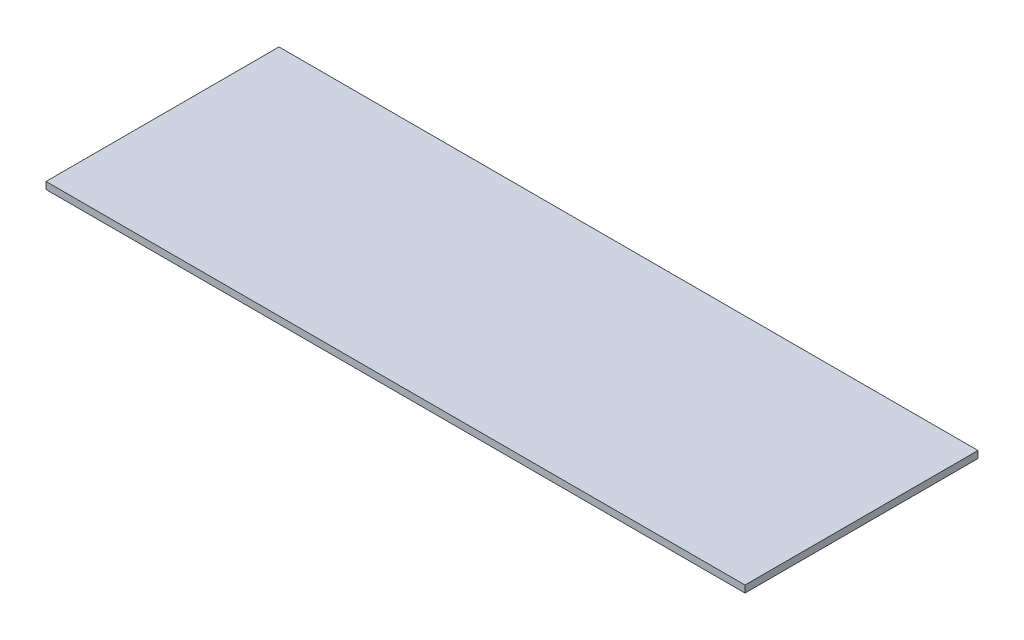
ISO-10303-21;
HEADER;
FILE_DESCRIPTION(('STEP AP214'),'2;1');
FILE_NAME('part.step','',(''),(''),'','','');
FILE_SCHEMA(('AUTOMOTIVE_DESIGN { 1 0 10303 214 1 1 1 1 }'));
ENDSEC;
DATA;
#1=APPLICATION_CONTEXT('core data for automotive mechanical design processes');
#2=APPLICATION_PROTOCOL_DEFINITION('international standard','automotive_design',2000,#1);
#3=PRODUCT_CONTEXT('',#1,'mechanical');
#4=PRODUCT('Part','Part','',(#3));
#5=PRODUCT_RELATED_PRODUCT_CATEGORY('part','',(#4));
#6=PRODUCT_DEFINITION_FORMATION('','',#4);
#7=PRODUCT_DEFINITION_CONTEXT('part definition',#1,'design');
#8=PRODUCT_DEFINITION('design','',#6,#7);
#9=PRODUCT_DEFINITION_SHAPE('','',#8);
#10=(LENGTH_UNIT() NAMED_UNIT(*) SI_UNIT(.MILLI.,.METRE.));
#11=(NAMED_UNIT(*) PLANE_ANGLE_UNIT() SI_UNIT($,.RADIAN.));
#12=(NAMED_UNIT(*) SI_UNIT($,.STERADIAN.) SOLID_ANGLE_UNIT());
#13=UNCERTAINTY_MEASURE_WITH_UNIT(LENGTH_MEASURE(1.E-05),#10,'distance_accuracy_value','');
#14=(GEOMETRIC_REPRESENTATION_CONTEXT(3) GLOBAL_UNCERTAINTY_ASSIGNED_CONTEXT((#13)) GLOBAL_UNIT_ASSIGNED_CONTEXT((#10,
#11,#12)) REPRESENTATION_CONTEXT('',''));
#15=CARTESIAN_POINT('',(0.,0.,0.));
#16=DIRECTION('',(0.,0.,1.));
#17=DIRECTION('',(1.,0.,0.));
#18=AXIS2_PLACEMENT_3D('',#15,#16,#17);
#19=CARTESIAN_POINT('',(-9.94318181818181,3.,81.5056818181818));
#20=DIRECTION('',(1.,0.,0.));
#21=DIRECTION('',(0.,0.,-1.));
#22=AXIS2_PLACEMENT_3D('',#19,#20,#21);
#23=PLANE('',#22);
#24=DIRECTION('',(0.,0.,1.));
#25=VECTOR('',#24,1.);
#26=CARTESIAN_POINT('',(-9.94318181818181,0.,81.5056818181818));
#27=LINE('',#26,#25);
#28=CARTESIAN_POINT('',(-9.94318181818181,0.,-18.4943181818182));
#29=VERTEX_POINT('',#28);
#30=CARTESIAN_POINT('',(-9.94318181818181,0.,81.5056818181818));
#31=VERTEX_POINT('',#30);
#32=EDGE_CURVE('E111',#29,#31,#27,.T.);
#33=ORIENTED_EDGE('',*,*,#32,.T.);
#34=DIRECTION('',(0.,-1.,0.));
#35=VECTOR('',#34,1.);
#36=CARTESIAN_POINT('',(-9.94318181818181,3.,81.5056818181818));
#37=LINE('',#36,#35);
#38=CARTESIAN_POINT('',(-9.94318181818181,3.,81.5056818181818));
#39=VERTEX_POINT('',#38);
#40=EDGE_CURVE('E11',#39,#31,#37,.T.);
#41=ORIENTED_EDGE('',*,*,#40,.F.);
#42=DIRECTION('',(0.,0.,1.));
#43=VECTOR('',#42,1.);
#44=CARTESIAN_POINT('',(-9.94318181818181,3.,81.5056818181818));
#45=LINE('',#44,#43);
#46=CARTESIAN_POINT('',(-9.94318181818181,3.,-18.4943181818182));
#47=VERTEX_POINT('',#46);
#48=EDGE_CURVE('E95',#47,#39,#45,.T.);
#49=ORIENTED_EDGE('',*,*,#48,.F.);
#50=DIRECTION('',(0.,-1.,0.));
#51=VECTOR('',#50,1.);
#52=CARTESIAN_POINT('',(-9.94318181818181,3.,-18.4943181818182));
#53=LINE('',#52,#51);
#54=EDGE_CURVE('E107',#47,#29,#53,.T.);
#55=ORIENTED_EDGE('',*,*,#54,.T.);
#56=EDGE_LOOP('',(#33,#41,#49,#55));
#57=FACE_BOUND('',#56,.T.);
#58=ADVANCED_FACE('F43',(#57),#23,.F.);
#59=CARTESIAN_POINT('',(-9.94318181818181,3.,81.5056818181818));
#60=DIRECTION('',(0.,0.,-1.));
#61=DIRECTION('',(-1.,0.,0.));
#62=AXIS2_PLACEMENT_3D('',#59,#60,#61);
#63=PLANE('',#62);
#64=DIRECTION('',(1.,0.,0.));
#65=VECTOR('',#64,1.);
#66=CARTESIAN_POINT('',(-9.94318181818181,0.,81.5056818181818));
#67=LINE('',#66,#65);
#68=CARTESIAN_POINT('',(290.056818181818,0.,81.5056818181818));
#69=VERTEX_POINT('',#68);
#70=EDGE_CURVE('E100',#31,#69,#67,.T.);
#71=ORIENTED_EDGE('',*,*,#70,.T.);
#72=DIRECTION('',(0.,-1.,0.));
#73=VECTOR('',#72,1.);
#74=CARTESIAN_POINT('',(290.056818181818,3.,81.5056818181818));
#75=LINE('',#74,#73);
#76=CARTESIAN_POINT('',(290.056818181818,3.,81.5056818181818));
#77=VERTEX_POINT('',#76);
#78=EDGE_CURVE('E52',#77,#69,#75,.T.);
#79=ORIENTED_EDGE('',*,*,#78,.F.);
#80=DIRECTION('',(1.,0.,0.));
#81=VECTOR('',#80,1.);
#82=CARTESIAN_POINT('',(-9.94318181818181,3.,81.5056818181818));
#83=LINE('',#82,#81);
#84=EDGE_CURVE('E90',#39,#77,#83,.T.);
#85=ORIENTED_EDGE('',*,*,#84,.F.);
#86=ORIENTED_EDGE('',*,*,#40,.T.);
#87=EDGE_LOOP('',(#71,#79,#85,#86));
#88=FACE_BOUND('',#87,.T.);
#89=ADVANCED_FACE('F99',(#88),#63,.F.);
#90=CARTESIAN_POINT('',(290.056818181818,3.,81.5056818181818));
#91=DIRECTION('',(-1.,0.,0.));
#92=DIRECTION('',(0.,0.,1.));
#93=AXIS2_PLACEMENT_3D('',#90,#91,#92);
#94=PLANE('',#93);
#95=DIRECTION('',(0.,0.,-1.));
#96=VECTOR('',#95,1.);
#97=CARTESIAN_POINT('',(290.056818181818,0.,81.5056818181818));
#98=LINE('',#97,#96);
#99=CARTESIAN_POINT('',(290.056818181818,0.,-18.4943181818182));
#100=VERTEX_POINT('',#99);
#101=EDGE_CURVE('E77',#69,#100,#98,.T.);
#102=ORIENTED_EDGE('',*,*,#101,.T.);
#103=DIRECTION('',(0.,-1.,0.));
#104=VECTOR('',#103,1.);
#105=CARTESIAN_POINT('',(290.056818181818,3.,-18.4943181818182));
#106=LINE('',#105,#104);
#107=CARTESIAN_POINT('',(290.056818181818,3.,-18.4943181818182));
#108=VERTEX_POINT('',#107);
#109=EDGE_CURVE('E102',#108,#100,#106,.T.);
#110=ORIENTED_EDGE('',*,*,#109,.F.);
#111=DIRECTION('',(0.,0.,-1.));
#112=VECTOR('',#111,1.);
#113=CARTESIAN_POINT('',(290.056818181818,3.,81.5056818181818));
#114=LINE('',#113,#112);
#115=EDGE_CURVE('E93',#77,#108,#114,.T.);
#116=ORIENTED_EDGE('',*,*,#115,.F.);
#117=ORIENTED_EDGE('',*,*,#78,.T.);
#118=EDGE_LOOP('',(#102,#110,#116,#117));
#119=FACE_BOUND('',#118,.T.);
#120=ADVANCED_FACE('F103',(#119),#94,.F.);
#121=CARTESIAN_POINT('',(-9.94318181818181,3.,-18.4943181818182));
#122=DIRECTION('',(0.,0.,1.));
#123=DIRECTION('',(1.,0.,0.));
#124=AXIS2_PLACEMENT_3D('',#121,#122,#123);
#125=PLANE('',#124);
#126=DIRECTION('',(-1.,0.,0.));
#127=VECTOR('',#126,1.);
#128=CARTESIAN_POINT('',(-9.94318181818181,0.,-18.4943181818182));
#129=LINE('',#128,#127);
#130=EDGE_CURVE('E83',#100,#29,#129,.T.);
#131=ORIENTED_EDGE('',*,*,#130,.T.);
#132=ORIENTED_EDGE('',*,*,#54,.F.);
#133=DIRECTION('',(-1.,0.,0.));
#134=VECTOR('',#133,1.);
#135=CARTESIAN_POINT('',(-9.94318181818181,3.,-18.4943181818182));
#136=LINE('',#135,#134);
#137=EDGE_CURVE('E60',#108,#47,#136,.T.);
#138=ORIENTED_EDGE('',*,*,#137,.F.);
#139=ORIENTED_EDGE('',*,*,#109,.T.);
#140=EDGE_LOOP('',(#131,#132,#138,#139));
#141=FACE_BOUND('',#140,.T.);
#142=ADVANCED_FACE('F124',(#141),#125,.F.);
#143=CARTESIAN_POINT('',(0.,3.,0.));
#144=DIRECTION('',(0.,-1.,0.));
#145=DIRECTION('',(0.,0.,-1.));
#146=AXIS2_PLACEMENT_3D('',#143,#144,#145);
#147=PLANE('',#146);
#148=ORIENTED_EDGE('',*,*,#48,.T.);
#149=ORIENTED_EDGE('',*,*,#84,.T.);
#150=ORIENTED_EDGE('',*,*,#115,.T.);
#151=ORIENTED_EDGE('',*,*,#137,.T.);
#152=EDGE_LOOP('',(#148,#149,#150,#151));
#153=FACE_BOUND('',#152,.T.);
#154=ADVANCED_FACE('F91',(#153),#147,.F.);
#155=CARTESIAN_POINT('',(0.,0.,0.));
#156=DIRECTION('',(0.,-1.,0.));
#157=DIRECTION('',(0.,0.,-1.));
#158=AXIS2_PLACEMENT_3D('',#155,#156,#157);
#159=PLANE('',#158);
#160=ORIENTED_EDGE('',*,*,#32,.F.);
#161=ORIENTED_EDGE('',*,*,#130,.F.);
#162=ORIENTED_EDGE('',*,*,#101,.F.);
#163=ORIENTED_EDGE('',*,*,#70,.F.);
#164=EDGE_LOOP('',(#160,#161,#162,#163));
#165=FACE_BOUND('',#164,.T.);
#166=ADVANCED_FACE('F127',(#165),#159,.T.);
#167=CLOSED_SHELL('',(#58,#89,#120,#142,#154,#166));
#168=MANIFOLD_SOLID_BREP('B2',#167);
#169=ADVANCED_BREP_SHAPE_REPRESENTATION('',(#18,#168),#14);
#170=SHAPE_DEFINITION_REPRESENTATION(#9,#169);
ENDSEC;
END-ISO-10303-21;
